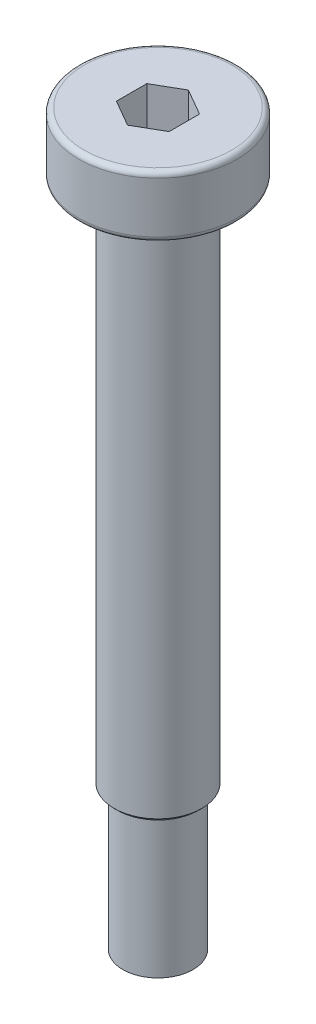
ISO-10303-21;
HEADER;
FILE_DESCRIPTION(('STEP AP214'),'2;1');
FILE_NAME('part.step','',(''),(''),'','','');
FILE_SCHEMA(('AUTOMOTIVE_DESIGN { 1 0 10303 214 1 1 1 1 }'));
ENDSEC;
DATA;
#1=APPLICATION_CONTEXT('core data for automotive mechanical design processes');
#2=APPLICATION_PROTOCOL_DEFINITION('international standard','automotive_design',2000,#1);
#3=PRODUCT_CONTEXT('',#1,'mechanical');
#4=PRODUCT('Part','Part','',(#3));
#5=PRODUCT_RELATED_PRODUCT_CATEGORY('part','',(#4));
#6=PRODUCT_DEFINITION_FORMATION('','',#4);
#7=PRODUCT_DEFINITION_CONTEXT('part definition',#1,'design');
#8=PRODUCT_DEFINITION('design','',#6,#7);
#9=PRODUCT_DEFINITION_SHAPE('','',#8);
#10=(LENGTH_UNIT() NAMED_UNIT(*) SI_UNIT(.MILLI.,.METRE.));
#11=(NAMED_UNIT(*) PLANE_ANGLE_UNIT() SI_UNIT($,.RADIAN.));
#12=(NAMED_UNIT(*) SI_UNIT($,.STERADIAN.) SOLID_ANGLE_UNIT());
#13=UNCERTAINTY_MEASURE_WITH_UNIT(LENGTH_MEASURE(1.E-05),#10,'distance_accuracy_value','');
#14=(GEOMETRIC_REPRESENTATION_CONTEXT(3) GLOBAL_UNCERTAINTY_ASSIGNED_CONTEXT((#13)) GLOBAL_UNIT_ASSIGNED_CONTEXT((#10,
#11,#12)) REPRESENTATION_CONTEXT('',''));
#15=CARTESIAN_POINT('',(0.,0.,0.));
#16=DIRECTION('',(0.,0.,1.));
#17=DIRECTION('',(1.,0.,0.));
#18=AXIS2_PLACEMENT_3D('',#15,#16,#17);
#19=CARTESIAN_POINT('',(0.,9.61644491026167,0.));
#20=DIRECTION('',(0.,1.,0.));
#21=DIRECTION('',(0.,0.,1.));
#22=AXIS2_PLACEMENT_3D('',#19,#20,#21);
#23=PLANE('',#22);
#24=DIRECTION('',(0.,0.,-1.));
#25=VECTOR('',#24,1.);
#26=CARTESIAN_POINT('',(1.5,9.61644491026167,0.86602540378444));
#27=LINE('',#26,#25);
#28=CARTESIAN_POINT('',(1.5,9.61644491026167,0.86602540378444));
#29=VERTEX_POINT('',#28);
#30=CARTESIAN_POINT('',(1.5,9.61644491026167,-0.866025403784439));
#31=VERTEX_POINT('',#30);
#32=EDGE_CURVE('E62',#29,#31,#27,.T.);
#33=ORIENTED_EDGE('',*,*,#32,.F.);
#34=DIRECTION('',(0.866025403784439,0.,-0.5));
#35=VECTOR('',#34,1.);
#36=CARTESIAN_POINT('',(0.,9.61644491026167,1.73205080756888));
#37=LINE('',#36,#35);
#38=CARTESIAN_POINT('',(0.,9.61644491026167,1.73205080756888));
#39=VERTEX_POINT('',#38);
#40=EDGE_CURVE('E155',#39,#29,#37,.T.);
#41=ORIENTED_EDGE('',*,*,#40,.F.);
#42=DIRECTION('',(0.866025403784438,0.,0.5));
#43=VECTOR('',#42,1.);
#44=CARTESIAN_POINT('',(-1.5,9.61644491026167,0.866025403784438));
#45=LINE('',#44,#43);
#46=CARTESIAN_POINT('',(-1.5,9.61644491026167,0.866025403784438));
#47=VERTEX_POINT('',#46);
#48=EDGE_CURVE('E152',#47,#39,#45,.T.);
#49=ORIENTED_EDGE('',*,*,#48,.F.);
#50=DIRECTION('',(0.,0.,1.));
#51=VECTOR('',#50,1.);
#52=CARTESIAN_POINT('',(-1.5,9.61644491026167,-0.866025403784439));
#53=LINE('',#52,#51);
#54=CARTESIAN_POINT('',(-1.5,9.61644491026167,-0.866025403784439));
#55=VERTEX_POINT('',#54);
#56=EDGE_CURVE('E110',#55,#47,#53,.T.);
#57=ORIENTED_EDGE('',*,*,#56,.F.);
#58=DIRECTION('',(-0.866025403784439,0.,0.5));
#59=VECTOR('',#58,1.);
#60=CARTESIAN_POINT('',(0.,9.61644491026167,-1.73205080756888));
#61=LINE('',#60,#59);
#62=CARTESIAN_POINT('',(0.,9.61644491026167,-1.73205080756888));
#63=VERTEX_POINT('',#62);
#64=EDGE_CURVE('E146',#63,#55,#61,.T.);
#65=ORIENTED_EDGE('',*,*,#64,.F.);
#66=DIRECTION('',(-0.866025403784439,0.,-0.5));
#67=VECTOR('',#66,1.);
#68=CARTESIAN_POINT('',(1.5,9.61644491026167,-0.866025403784438));
#69=LINE('',#68,#67);
#70=EDGE_CURVE('E142',#31,#63,#69,.T.);
#71=ORIENTED_EDGE('',*,*,#70,.F.);
#72=EDGE_LOOP('',(#33,#41,#49,#57,#65,#71));
#73=FACE_BOUND('',#72,.T.);
#74=CARTESIAN_POINT('',(0.,9.61644491026167,0.));
#75=DIRECTION('',(0.,1.,0.));
#76=DIRECTION('',(0.,0.,1.));
#77=AXIS2_PLACEMENT_3D('',#74,#75,#76);
#78=CIRCLE('',#77,4.2);
#79=CARTESIAN_POINT('',(0.,9.61644491026167,4.2));
#80=VERTEX_POINT('',#79);
#81=EDGE_CURVE('E194',#80,#80,#78,.T.);
#82=ORIENTED_EDGE('',*,*,#81,.T.);
#83=EDGE_LOOP('',(#82));
#84=FACE_BOUND('',#83,.T.);
#85=ADVANCED_FACE('F45',(#73,#84),#23,.T.);
#86=CARTESIAN_POINT('',(0.,13.2929154984969,0.));
#87=DIRECTION('',(0.,1.,0.));
#88=DIRECTION('',(0.,0.,1.));
#89=AXIS2_PLACEMENT_3D('',#86,#87,#88);
#90=CYLINDRICAL_SURFACE('',#89,4.5);
#91=CARTESIAN_POINT('',(0.,6.41644491026167,0.));
#92=DIRECTION('',(0.,-1.,0.));
#93=DIRECTION('',(0.,0.,-1.));
#94=AXIS2_PLACEMENT_3D('',#91,#92,#93);
#95=CIRCLE('',#94,4.5);
#96=CARTESIAN_POINT('',(0.,6.41644491026167,-4.5));
#97=VERTEX_POINT('',#96);
#98=EDGE_CURVE('E186',#97,#97,#95,.F.);
#99=ORIENTED_EDGE('',*,*,#98,.T.);
#100=EDGE_LOOP('',(#99));
#101=FACE_BOUND('',#100,.T.);
#102=CARTESIAN_POINT('',(0.,9.31644491026167,0.));
#103=DIRECTION('',(0.,1.,0.));
#104=DIRECTION('',(0.,0.,1.));
#105=AXIS2_PLACEMENT_3D('',#102,#103,#104);
#106=CIRCLE('',#105,4.5);
#107=CARTESIAN_POINT('',(0.,9.31644491026167,4.5));
#108=VERTEX_POINT('',#107);
#109=EDGE_CURVE('E182',#108,#108,#106,.F.);
#110=ORIENTED_EDGE('',*,*,#109,.T.);
#111=EDGE_LOOP('',(#110));
#112=FACE_BOUND('',#111,.T.);
#113=ADVANCED_FACE('F213',(#101,#112),#90,.T.);
#114=CARTESIAN_POINT('',(-4.5,6.11644491026167,0.));
#115=DIRECTION('',(0.,-1.,0.));
#116=DIRECTION('',(0.,0.,-1.));
#117=AXIS2_PLACEMENT_3D('',#114,#115,#116);
#118=PLANE('',#117);
#119=CARTESIAN_POINT('',(0.,6.11644491026167,0.));
#120=DIRECTION('',(0.,-1.,0.));
#121=DIRECTION('',(0.,0.,-1.));
#122=AXIS2_PLACEMENT_3D('',#119,#120,#121);
#123=CIRCLE('',#122,4.2);
#124=CARTESIAN_POINT('',(0.,6.11644491026167,-4.2));
#125=VERTEX_POINT('',#124);
#126=EDGE_CURVE('E190',#125,#125,#123,.T.);
#127=ORIENTED_EDGE('',*,*,#126,.T.);
#128=EDGE_LOOP('',(#127));
#129=FACE_BOUND('',#128,.T.);
#130=CARTESIAN_POINT('',(0.,6.11644491026167,0.));
#131=DIRECTION('',(0.,1.,0.));
#132=DIRECTION('',(0.,0.,1.));
#133=AXIS2_PLACEMENT_3D('',#130,#131,#132);
#134=CIRCLE('',#133,2.5);
#135=CARTESIAN_POINT('',(0.,6.11644491026167,2.5));
#136=VERTEX_POINT('',#135);
#137=EDGE_CURVE('E178',#136,#136,#134,.T.);
#138=ORIENTED_EDGE('',*,*,#137,.T.);
#139=EDGE_LOOP('',(#138));
#140=FACE_BOUND('',#139,.T.);
#141=ADVANCED_FACE('F219',(#129,#140),#118,.T.);
#142=CARTESIAN_POINT('',(0.,13.2929154984969,0.));
#143=DIRECTION('',(0.,1.,0.));
#144=DIRECTION('',(0.,0.,1.));
#145=AXIS2_PLACEMENT_3D('',#142,#143,#144);
#146=CYLINDRICAL_SURFACE('',#145,2.5);
#147=CARTESIAN_POINT('',(0.,-23.6835550897383,0.));
#148=DIRECTION('',(0.,-1.,0.));
#149=DIRECTION('',(0.,0.,-1.));
#150=AXIS2_PLACEMENT_3D('',#147,#148,#149);
#151=CIRCLE('',#150,2.5);
#152=CARTESIAN_POINT('',(0.,-23.6835550897383,-2.5));
#153=VERTEX_POINT('',#152);
#154=EDGE_CURVE('E55',#153,#153,#151,.F.);
#155=ORIENTED_EDGE('',*,*,#154,.T.);
#156=EDGE_LOOP('',(#155));
#157=FACE_BOUND('',#156,.T.);
#158=ORIENTED_EDGE('',*,*,#137,.F.);
#159=EDGE_LOOP('',(#158));
#160=FACE_BOUND('',#159,.T.);
#161=ADVANCED_FACE('F201',(#157,#160),#146,.T.);
#162=CARTESIAN_POINT('',(-2.5,-23.8835550897383,0.));
#163=DIRECTION('',(0.,-1.,0.));
#164=DIRECTION('',(0.,0.,-1.));
#165=AXIS2_PLACEMENT_3D('',#162,#163,#164);
#166=PLANE('',#165);
#167=CARTESIAN_POINT('',(0.,-23.8835550897383,0.));
#168=DIRECTION('',(0.,-1.,0.));
#169=DIRECTION('',(0.,0.,-1.));
#170=AXIS2_PLACEMENT_3D('',#167,#168,#169);
#171=CIRCLE('',#170,2.29999999999999);
#172=CARTESIAN_POINT('',(0.,-23.8835550897383,-2.29999999999999));
#173=VERTEX_POINT('',#172);
#174=EDGE_CURVE('E11',#173,#173,#171,.T.);
#175=ORIENTED_EDGE('',*,*,#174,.T.);
#176=EDGE_LOOP('',(#175));
#177=FACE_BOUND('',#176,.T.);
#178=CARTESIAN_POINT('',(0.,-23.8835550897383,0.));
#179=DIRECTION('',(0.,1.,0.));
#180=DIRECTION('',(0.,0.,1.));
#181=AXIS2_PLACEMENT_3D('',#178,#179,#180);
#182=CIRCLE('',#181,2.);
#183=CARTESIAN_POINT('',(0.,-23.8835550897383,2.));
#184=VERTEX_POINT('',#183);
#185=EDGE_CURVE('E174',#184,#184,#182,.T.);
#186=ORIENTED_EDGE('',*,*,#185,.T.);
#187=EDGE_LOOP('',(#186));
#188=FACE_BOUND('',#187,.T.);
#189=ADVANCED_FACE('F255',(#177,#188),#166,.T.);
#190=CARTESIAN_POINT('',(0.,13.2929154984969,0.));
#191=DIRECTION('',(0.,1.,0.));
#192=DIRECTION('',(0.,0.,1.));
#193=AXIS2_PLACEMENT_3D('',#190,#191,#192);
#194=CYLINDRICAL_SURFACE('',#193,1.99999999999999);
#195=CARTESIAN_POINT('',(0.,-31.8835550897383,0.));
#196=DIRECTION('',(0.,1.,0.));
#197=DIRECTION('',(0.,0.,1.));
#198=AXIS2_PLACEMENT_3D('',#195,#196,#197);
#199=CIRCLE('',#198,1.99999999999999);
#200=CARTESIAN_POINT('',(0.,-31.8835550897383,1.99999999999999));
#201=VERTEX_POINT('',#200);
#202=EDGE_CURVE('E161',#201,#201,#199,.T.);
#203=ORIENTED_EDGE('',*,*,#202,.T.);
#204=EDGE_LOOP('',(#203));
#205=FACE_BOUND('',#204,.T.);
#206=ORIENTED_EDGE('',*,*,#185,.F.);
#207=EDGE_LOOP('',(#206));
#208=FACE_BOUND('',#207,.T.);
#209=ADVANCED_FACE('F251',(#205,#208),#194,.T.);
#210=CARTESIAN_POINT('',(-1.99999999999999,-31.8835550897383,0.));
#211=DIRECTION('',(0.,-1.,0.));
#212=DIRECTION('',(0.,0.,-1.));
#213=AXIS2_PLACEMENT_3D('',#210,#211,#212);
#214=PLANE('',#213);
#215=ORIENTED_EDGE('',*,*,#202,.F.);
#216=EDGE_LOOP('',(#215));
#217=FACE_BOUND('',#216,.T.);
#218=ADVANCED_FACE('F228',(#217),#214,.T.);
#219=CARTESIAN_POINT('',(0.,6.41644491026167,0.));
#220=DIRECTION('',(0.,-1.,0.));
#221=DIRECTION('',(0.,0.,-1.));
#222=AXIS2_PLACEMENT_3D('',#219,#220,#221);
#223=TOROIDAL_SURFACE('',#222,4.2,0.3);
#224=ORIENTED_EDGE('',*,*,#126,.F.);
#225=EDGE_LOOP('',(#224));
#226=FACE_BOUND('',#225,.T.);
#227=ORIENTED_EDGE('',*,*,#98,.F.);
#228=EDGE_LOOP('',(#227));
#229=FACE_BOUND('',#228,.T.);
#230=ADVANCED_FACE('F225',(#226,#229),#223,.T.);
#231=CARTESIAN_POINT('',(0.,9.31644491026167,0.));
#232=DIRECTION('',(0.,1.,0.));
#233=DIRECTION('',(0.,0.,1.));
#234=AXIS2_PLACEMENT_3D('',#231,#232,#233);
#235=TOROIDAL_SURFACE('',#234,4.2,0.3);
#236=ORIENTED_EDGE('',*,*,#109,.F.);
#237=EDGE_LOOP('',(#236));
#238=FACE_BOUND('',#237,.T.);
#239=ORIENTED_EDGE('',*,*,#81,.F.);
#240=EDGE_LOOP('',(#239));
#241=FACE_BOUND('',#240,.T.);
#242=ADVANCED_FACE('F227',(#238,#241),#235,.T.);
#243=CARTESIAN_POINT('',(1.5,7.21644491026167,0.86602540378444));
#244=DIRECTION('',(1.,0.,0.));
#245=DIRECTION('',(0.,0.,-1.));
#246=AXIS2_PLACEMENT_3D('',#243,#244,#245);
#247=PLANE('',#246);
#248=ORIENTED_EDGE('',*,*,#32,.T.);
#249=DIRECTION('',(0.,1.,0.));
#250=VECTOR('',#249,1.);
#251=CARTESIAN_POINT('',(1.5,7.21644491026167,-0.866025403784438));
#252=LINE('',#251,#250);
#253=CARTESIAN_POINT('',(1.5,7.21644491026167,-0.866025403784438));
#254=VERTEX_POINT('',#253);
#255=EDGE_CURVE('E92',#254,#31,#252,.T.);
#256=ORIENTED_EDGE('',*,*,#255,.F.);
#257=DIRECTION('',(0.,0.,-1.));
#258=VECTOR('',#257,1.);
#259=CARTESIAN_POINT('',(1.5,7.21644491026167,0.86602540378444));
#260=LINE('',#259,#258);
#261=CARTESIAN_POINT('',(1.5,7.21644491026167,0.86602540378444));
#262=VERTEX_POINT('',#261);
#263=EDGE_CURVE('E158',#262,#254,#260,.T.);
#264=ORIENTED_EDGE('',*,*,#263,.F.);
#265=DIRECTION('',(0.,1.,0.));
#266=VECTOR('',#265,1.);
#267=CARTESIAN_POINT('',(1.5,7.21644491026167,0.86602540378444));
#268=LINE('',#267,#266);
#269=EDGE_CURVE('E70',#262,#29,#268,.T.);
#270=ORIENTED_EDGE('',*,*,#269,.T.);
#271=EDGE_LOOP('',(#248,#256,#264,#270));
#272=FACE_BOUND('',#271,.T.);
#273=ADVANCED_FACE('F231',(#272),#247,.F.);
#274=CARTESIAN_POINT('',(0.,7.21644491026167,1.73205080756888));
#275=DIRECTION('',(0.5,0.,0.866025403784439));
#276=DIRECTION('',(0.866025403784439,0.,-0.5));
#277=AXIS2_PLACEMENT_3D('',#274,#275,#276);
#278=PLANE('',#277);
#279=ORIENTED_EDGE('',*,*,#40,.T.);
#280=ORIENTED_EDGE('',*,*,#269,.F.);
#281=DIRECTION('',(0.866025403784439,0.,-0.5));
#282=VECTOR('',#281,1.);
#283=CARTESIAN_POINT('',(0.,7.21644491026167,1.73205080756888));
#284=LINE('',#283,#282);
#285=CARTESIAN_POINT('',(0.,7.21644491026167,1.73205080756888));
#286=VERTEX_POINT('',#285);
#287=EDGE_CURVE('E124',#286,#262,#284,.T.);
#288=ORIENTED_EDGE('',*,*,#287,.F.);
#289=DIRECTION('',(0.,1.,0.));
#290=VECTOR('',#289,1.);
#291=CARTESIAN_POINT('',(0.,7.21644491026167,1.73205080756888));
#292=LINE('',#291,#290);
#293=EDGE_CURVE('E115',#286,#39,#292,.T.);
#294=ORIENTED_EDGE('',*,*,#293,.T.);
#295=EDGE_LOOP('',(#279,#280,#288,#294));
#296=FACE_BOUND('',#295,.T.);
#297=ADVANCED_FACE('F236',(#296),#278,.F.);
#298=CARTESIAN_POINT('',(-1.5,7.21644491026167,0.866025403784438));
#299=DIRECTION('',(-0.5,0.,0.866025403784439));
#300=DIRECTION('',(0.866025403784439,0.,0.5));
#301=AXIS2_PLACEMENT_3D('',#298,#299,#300);
#302=PLANE('',#301);
#303=ORIENTED_EDGE('',*,*,#48,.T.);
#304=ORIENTED_EDGE('',*,*,#293,.F.);
#305=DIRECTION('',(0.866025403784438,0.,0.5));
#306=VECTOR('',#305,1.);
#307=CARTESIAN_POINT('',(-1.5,7.21644491026167,0.866025403784438));
#308=LINE('',#307,#306);
#309=CARTESIAN_POINT('',(-1.5,7.21644491026167,0.866025403784438));
#310=VERTEX_POINT('',#309);
#311=EDGE_CURVE('E119',#310,#286,#308,.T.);
#312=ORIENTED_EDGE('',*,*,#311,.F.);
#313=DIRECTION('',(0.,1.,0.));
#314=VECTOR('',#313,1.);
#315=CARTESIAN_POINT('',(-1.5,7.21644491026167,0.866025403784438));
#316=LINE('',#315,#314);
#317=EDGE_CURVE('E103',#310,#47,#316,.T.);
#318=ORIENTED_EDGE('',*,*,#317,.T.);
#319=EDGE_LOOP('',(#303,#304,#312,#318));
#320=FACE_BOUND('',#319,.T.);
#321=ADVANCED_FACE('F120',(#320),#302,.F.);
#322=CARTESIAN_POINT('',(-1.5,7.21644491026167,-0.866025403784439));
#323=DIRECTION('',(-1.,0.,0.));
#324=DIRECTION('',(0.,0.,1.));
#325=AXIS2_PLACEMENT_3D('',#322,#323,#324);
#326=PLANE('',#325);
#327=ORIENTED_EDGE('',*,*,#56,.T.);
#328=ORIENTED_EDGE('',*,*,#317,.F.);
#329=DIRECTION('',(0.,0.,1.));
#330=VECTOR('',#329,1.);
#331=CARTESIAN_POINT('',(-1.5,7.21644491026167,-0.866025403784439));
#332=LINE('',#331,#330);
#333=CARTESIAN_POINT('',(-1.5,7.21644491026167,-0.866025403784439));
#334=VERTEX_POINT('',#333);
#335=EDGE_CURVE('E107',#334,#310,#332,.T.);
#336=ORIENTED_EDGE('',*,*,#335,.F.);
#337=DIRECTION('',(0.,1.,0.));
#338=VECTOR('',#337,1.);
#339=CARTESIAN_POINT('',(-1.5,7.21644491026167,-0.866025403784439));
#340=LINE('',#339,#338);
#341=EDGE_CURVE('E116',#334,#55,#340,.T.);
#342=ORIENTED_EDGE('',*,*,#341,.T.);
#343=EDGE_LOOP('',(#327,#328,#336,#342));
#344=FACE_BOUND('',#343,.T.);
#345=ADVANCED_FACE('F105',(#344),#326,.F.);
#346=CARTESIAN_POINT('',(0.,7.21644491026167,-1.73205080756888));
#347=DIRECTION('',(-0.5,0.,-0.866025403784439));
#348=DIRECTION('',(-0.866025403784439,0.,0.5));
#349=AXIS2_PLACEMENT_3D('',#346,#347,#348);
#350=PLANE('',#349);
#351=ORIENTED_EDGE('',*,*,#64,.T.);
#352=ORIENTED_EDGE('',*,*,#341,.F.);
#353=DIRECTION('',(-0.866025403784439,0.,0.5));
#354=VECTOR('',#353,1.);
#355=CARTESIAN_POINT('',(0.,7.21644491026167,-1.73205080756888));
#356=LINE('',#355,#354);
#357=CARTESIAN_POINT('',(0.,7.21644491026167,-1.73205080756888));
#358=VERTEX_POINT('',#357);
#359=EDGE_CURVE('E130',#358,#334,#356,.T.);
#360=ORIENTED_EDGE('',*,*,#359,.F.);
#361=DIRECTION('',(0.,1.,0.));
#362=VECTOR('',#361,1.);
#363=CARTESIAN_POINT('',(0.,7.21644491026167,-1.73205080756888));
#364=LINE('',#363,#362);
#365=EDGE_CURVE('E166',#358,#63,#364,.T.);
#366=ORIENTED_EDGE('',*,*,#365,.T.);
#367=EDGE_LOOP('',(#351,#352,#360,#366));
#368=FACE_BOUND('',#367,.T.);
#369=ADVANCED_FACE('F331',(#368),#350,.F.);
#370=CARTESIAN_POINT('',(1.5,7.21644491026167,-0.866025403784438));
#371=DIRECTION('',(0.5,0.,-0.866025403784439));
#372=DIRECTION('',(-0.866025403784439,0.,-0.5));
#373=AXIS2_PLACEMENT_3D('',#370,#371,#372);
#374=PLANE('',#373);
#375=ORIENTED_EDGE('',*,*,#70,.T.);
#376=ORIENTED_EDGE('',*,*,#365,.F.);
#377=DIRECTION('',(-0.866025403784439,0.,-0.5));
#378=VECTOR('',#377,1.);
#379=CARTESIAN_POINT('',(1.5,7.21644491026167,-0.866025403784438));
#380=LINE('',#379,#378);
#381=EDGE_CURVE('E134',#254,#358,#380,.T.);
#382=ORIENTED_EDGE('',*,*,#381,.F.);
#383=ORIENTED_EDGE('',*,*,#255,.T.);
#384=EDGE_LOOP('',(#375,#376,#382,#383));
#385=FACE_BOUND('',#384,.T.);
#386=ADVANCED_FACE('F209',(#385),#374,.F.);
#387=CARTESIAN_POINT('',(0.,7.21644491026167,0.));
#388=DIRECTION('',(0.,1.,0.));
#389=DIRECTION('',(0.,0.,1.));
#390=AXIS2_PLACEMENT_3D('',#387,#388,#389);
#391=PLANE('',#390);
#392=ORIENTED_EDGE('',*,*,#263,.T.);
#393=ORIENTED_EDGE('',*,*,#381,.T.);
#394=ORIENTED_EDGE('',*,*,#359,.T.);
#395=ORIENTED_EDGE('',*,*,#335,.T.);
#396=ORIENTED_EDGE('',*,*,#311,.T.);
#397=ORIENTED_EDGE('',*,*,#287,.T.);
#398=EDGE_LOOP('',(#392,#393,#394,#395,#396,#397));
#399=FACE_BOUND('',#398,.T.);
#400=ADVANCED_FACE('F127',(#399),#391,.T.);
#401=CARTESIAN_POINT('',(0.,-23.6835550897383,0.));
#402=DIRECTION('',(0.,1.,0.));
#403=DIRECTION('',(0.,0.,1.));
#404=AXIS2_PLACEMENT_3D('',#401,#402,#403);
#405=CONICAL_SURFACE('',#404,2.5,0.785398163397454);
#406=ORIENTED_EDGE('',*,*,#174,.F.);
#407=EDGE_LOOP('',(#406));
#408=FACE_BOUND('',#407,.T.);
#409=ORIENTED_EDGE('',*,*,#154,.F.);
#410=EDGE_LOOP('',(#409));
#411=FACE_BOUND('',#410,.T.);
#412=ADVANCED_FACE('F48',(#408,#411),#405,.T.);
#413=CLOSED_SHELL('',(#85,#113,#141,#161,#189,#209,#218,#230,#242,#273,#297,#321,#345,#369,#386,
#400,#412));
#414=MANIFOLD_SOLID_BREP('B2',#413);
#415=ADVANCED_BREP_SHAPE_REPRESENTATION('',(#18,#414),#14);
#416=SHAPE_DEFINITION_REPRESENTATION(#9,#415);
ENDSEC;
END-ISO-10303-21;
